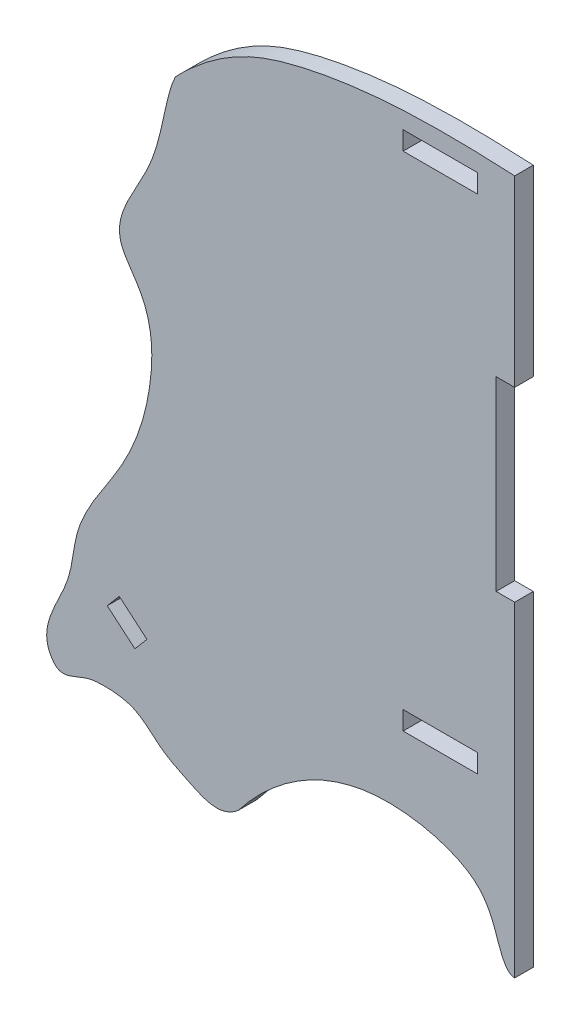
ISO-10303-21;
HEADER;
FILE_DESCRIPTION(('STEP AP214'),'2;1');
FILE_NAME('part.step','',(''),(''),'','','');
FILE_SCHEMA(('AUTOMOTIVE_DESIGN { 1 0 10303 214 1 1 1 1 }'));
ENDSEC;
DATA;
#1=APPLICATION_CONTEXT('core data for automotive mechanical design processes');
#2=APPLICATION_PROTOCOL_DEFINITION('international standard','automotive_design',2000,#1);
#3=PRODUCT_CONTEXT('',#1,'mechanical');
#4=PRODUCT('Part','Part','',(#3));
#5=PRODUCT_RELATED_PRODUCT_CATEGORY('part','',(#4));
#6=PRODUCT_DEFINITION_FORMATION('','',#4);
#7=PRODUCT_DEFINITION_CONTEXT('part definition',#1,'design');
#8=PRODUCT_DEFINITION('design','',#6,#7);
#9=PRODUCT_DEFINITION_SHAPE('','',#8);
#10=(LENGTH_UNIT() NAMED_UNIT(*) SI_UNIT(.MILLI.,.METRE.));
#11=(NAMED_UNIT(*) PLANE_ANGLE_UNIT() SI_UNIT($,.RADIAN.));
#12=(NAMED_UNIT(*) SI_UNIT($,.STERADIAN.) SOLID_ANGLE_UNIT());
#13=UNCERTAINTY_MEASURE_WITH_UNIT(LENGTH_MEASURE(1.E-05),#10,'distance_accuracy_value','');
#14=(GEOMETRIC_REPRESENTATION_CONTEXT(3) GLOBAL_UNCERTAINTY_ASSIGNED_CONTEXT((#13)) GLOBAL_UNIT_ASSIGNED_CONTEXT((#10,
#11,#12)) REPRESENTATION_CONTEXT('',''));
#15=CARTESIAN_POINT('',(0.,0.,0.));
#16=DIRECTION('',(0.,0.,1.));
#17=DIRECTION('',(1.,0.,0.));
#18=AXIS2_PLACEMENT_3D('',#15,#16,#17);
#19=CARTESIAN_POINT('',(123.117231850983,297.768158299305,0.558511618268249));
#20=DIRECTION('',(0.,0.,-1.));
#21=DIRECTION('',(-1.,0.,0.));
#22=AXIS2_PLACEMENT_3D('',#19,#20,#21);
#23=PLANE('',#22);
#24=DIRECTION('',(-1.,0.,0.));
#25=VECTOR('',#24,1.);
#26=CARTESIAN_POINT('',(123.117231850983,313.87680844309,0.558511618268249));
#27=LINE('',#26,#25);
#28=CARTESIAN_POINT('',(191.916318128345,313.87680844309,0.558511618268249));
#29=VERTEX_POINT('',#28);
#30=CARTESIAN_POINT('',(188.741318128345,313.87680844309,0.558511618268249));
#31=VERTEX_POINT('',#30);
#32=EDGE_CURVE('E362',#29,#31,#27,.T.);
#33=ORIENTED_EDGE('',*,*,#32,.F.);
#34=DIRECTION('',(0.,1.,0.));
#35=VECTOR('',#34,1.);
#36=CARTESIAN_POINT('',(191.916318128345,258.318555662201,0.558511618268249));
#37=LINE('',#36,#35);
#38=CARTESIAN_POINT('',(191.916318128345,258.318555662201,0.558511618268249));
#39=VERTEX_POINT('',#38);
#40=EDGE_CURVE('E322',#39,#29,#37,.T.);
#41=ORIENTED_EDGE('',*,*,#40,.F.);
#42=CARTESIAN_POINT('',(144.769687539417,259.544842569012,0.558511618268249));
#43=CARTESIAN_POINT('',(150.29639773086,266.721797116795,0.558511618268249));
#44=CARTESIAN_POINT('',(162.978632474186,276.12938968086,0.558511618268249));
#45=CARTESIAN_POINT('',(183.438337531095,271.813982255498,0.558511618268249));
#46=CARTESIAN_POINT('',(188.429136197785,265.777589499859,0.558511618268249));
#47=CARTESIAN_POINT('',(190.091835847159,258.338539578177,0.558511618268249));
#48=CARTESIAN_POINT('',(191.916318128345,258.318555662201,0.558511618268249));
#49=B_SPLINE_CURVE_WITH_KNOTS('',3,(#42,#43,#44,#45,#46,#47,#48),.UNSPECIFIED.,.F.,.F.,(4,1,1,1,
4),(0.,0.461148567866959,0.724471904206736,0.870774393200556,1.),.UNSPECIFIED.);
#50=CARTESIAN_POINT('',(144.769687539417,259.544842569012,0.558511618268249));
#51=VERTEX_POINT('',#50);
#52=EDGE_CURVE('E314',#51,#39,#49,.T.);
#53=ORIENTED_EDGE('',*,*,#52,.F.);
#54=CARTESIAN_POINT('',(133.999478323766,362.592540531734,0.558511618268249));
#55=CARTESIAN_POINT('',(132.225086022027,359.043755928256,0.558511618268249));
#56=CARTESIAN_POINT('',(131.718991404041,347.215999379062,0.558511618268249));
#57=CARTESIAN_POINT('',(121.59348862882,335.694092614909,0.558511618268249));
#58=CARTESIAN_POINT('',(130.114544976729,326.233660187884,0.558511618268249));
#59=CARTESIAN_POINT('',(130.349026805153,313.920019132553,0.558511618268249));
#60=CARTESIAN_POINT('',(125.602192039973,299.937731992035,0.558511618268249));
#61=CARTESIAN_POINT('',(116.738560739054,289.423865848565,0.558511618268249));
#62=CARTESIAN_POINT('',(116.321800980632,277.330302488856,0.558511618268249));
#63=CARTESIAN_POINT('',(109.999324026042,269.793746806495,0.558511618268249));
#64=CARTESIAN_POINT('',(114.535033749614,263.863367746362,0.558511618268249));
#65=CARTESIAN_POINT('',(118.172133947082,266.276595589519,0.558511618268249));
#66=CARTESIAN_POINT('',(122.391490283221,266.563369112397,0.558511618268249));
#67=CARTESIAN_POINT('',(127.574039437011,266.119644434109,0.558511618268249));
#68=CARTESIAN_POINT('',(131.335031689959,261.838429869952,0.558511618268249));
#69=CARTESIAN_POINT('',(137.381766546983,259.04921985697,0.558511618268249));
#70=CARTESIAN_POINT('',(141.619841476374,256.822631828868,0.558511618268249));
#71=CARTESIAN_POINT('',(144.769687539417,259.544842569012,0.558511618268249));
#72=B_SPLINE_CURVE_WITH_KNOTS('',3,(#54,#55,#56,#57,#58,#59,#60,#61,#62,#63,#64,#65,#66,#67,#68,
#69,#70,#71),.UNSPECIFIED.,.F.,.F.,(4,1,1,1,1,1,1,1,1,1,1,1,1,1,1,4),(0.,0.114205378378205,
0.2236235972446,0.270869686785501,0.365219368673239,0.477902129221363,0.593513084642484,
0.648017370225942,0.743465038591175,0.757288105268629,0.792684769494913,0.815193244013961,
0.853743181285876,0.899321619486176,0.933314838344055,1.),.UNSPECIFIED.);
#73=CARTESIAN_POINT('',(133.999478323766,362.592540531734,0.558511618268249));
#74=VERTEX_POINT('',#73);
#75=EDGE_CURVE('E264',#74,#51,#72,.T.);
#76=ORIENTED_EDGE('',*,*,#75,.F.);
#77=CARTESIAN_POINT('',(191.916318128345,376.899734652235,0.558511618268249));
#78=CARTESIAN_POINT('',(180.125512955205,377.5041531383,0.558511618268249));
#79=CARTESIAN_POINT('',(165.150769755078,377.50406242085,0.558511618268249));
#80=CARTESIAN_POINT('',(144.863568682566,371.975111744607,0.558511618268249));
#81=CARTESIAN_POINT('',(137.984827086445,366.718997179647,0.558511618268249));
#82=CARTESIAN_POINT('',(133.999478323766,362.592540531734,0.558511618268249));
#83=B_SPLINE_CURVE_WITH_KNOTS('',3,(#77,#78,#79,#80,#81,#82),.UNSPECIFIED.,.F.,.F.,(4,1,1,4),
(0.549425740135804,0.805603625701848,0.876196594203151,1.),.UNSPECIFIED.);
#84=CARTESIAN_POINT('',(191.916318128345,376.899734652235,0.558511618268249));
#85=VERTEX_POINT('',#84);
#86=EDGE_CURVE('E272',#85,#74,#83,.T.);
#87=ORIENTED_EDGE('',*,*,#86,.F.);
#88=CARTESIAN_POINT('',(191.916318128345,345.62680844309,0.558511618268249));
#89=VERTEX_POINT('',#88);
#90=EDGE_CURVE('E321',#89,#85,#37,.T.);
#91=ORIENTED_EDGE('',*,*,#90,.F.);
#92=DIRECTION('',(1.,0.,0.));
#93=VECTOR('',#92,1.);
#94=CARTESIAN_POINT('',(123.117231850983,345.62680844309,0.558511618268249));
#95=LINE('',#94,#93);
#96=CARTESIAN_POINT('',(188.741318128345,345.62680844309,0.558511618268249));
#97=VERTEX_POINT('',#96);
#98=EDGE_CURVE('E360',#97,#89,#95,.T.);
#99=ORIENTED_EDGE('',*,*,#98,.F.);
#100=DIRECTION('',(0.,-1.,0.));
#101=VECTOR('',#100,1.);
#102=CARTESIAN_POINT('',(188.741318128345,297.768158299305,0.558511618268249));
#103=LINE('',#102,#101);
#104=EDGE_CURVE('E357',#97,#31,#103,.T.);
#105=ORIENTED_EDGE('',*,*,#104,.T.);
#106=EDGE_LOOP('',(#33,#41,#53,#76,#87,#91,#99,#105));
#107=FACE_BOUND('',#106,.T.);
#108=DIRECTION('',(0.,1.,0.));
#109=VECTOR('',#108,1.);
#110=CARTESIAN_POINT('',(185.566318128345,371.02680844309,0.558511617910346));
#111=LINE('',#110,#109);
#112=CARTESIAN_POINT('',(185.566318128345,371.02680844309,0.558511617910346));
#113=VERTEX_POINT('',#112);
#114=CARTESIAN_POINT('',(185.566318128345,374.20180844309,0.558511617910346));
#115=VERTEX_POINT('',#114);
#116=EDGE_CURVE('E215',#113,#115,#111,.T.);
#117=ORIENTED_EDGE('',*,*,#116,.T.);
#118=DIRECTION('',(-1.,0.,0.));
#119=VECTOR('',#118,1.);
#120=CARTESIAN_POINT('',(123.117231850983,374.20180844309,0.558511618268249));
#121=LINE('',#120,#119);
#122=CARTESIAN_POINT('',(172.866318128345,374.20180844309,0.558511617910339));
#123=VERTEX_POINT('',#122);
#124=EDGE_CURVE('E354',#115,#123,#121,.T.);
#125=ORIENTED_EDGE('',*,*,#124,.T.);
#126=DIRECTION('',(0.,1.,0.));
#127=VECTOR('',#126,1.);
#128=CARTESIAN_POINT('',(172.866318128345,371.02680844309,0.558511617910339));
#129=LINE('',#128,#127);
#130=CARTESIAN_POINT('',(172.866318128345,371.02680844309,0.558511618268249));
#131=VERTEX_POINT('',#130);
#132=EDGE_CURVE('E212',#131,#123,#129,.T.);
#133=ORIENTED_EDGE('',*,*,#132,.F.);
#134=DIRECTION('',(-1.,0.,0.));
#135=VECTOR('',#134,1.);
#136=CARTESIAN_POINT('',(123.117231850983,371.02680844309,0.558511618268249));
#137=LINE('',#136,#135);
#138=EDGE_CURVE('E351',#113,#131,#137,.T.);
#139=ORIENTED_EDGE('',*,*,#138,.F.);
#140=EDGE_LOOP('',(#117,#125,#133,#139));
#141=FACE_BOUND('',#140,.T.);
#142=DIRECTION('',(-0.647381828332102,-0.762165840447724,0.));
#143=VECTOR('',#142,1.);
#144=CARTESIAN_POINT('',(140.72655181769,300.196717603194,0.558511618268255));
#145=LINE('',#144,#143);
#146=CARTESIAN_POINT('',(124.416384209225,280.994676305285,0.558511618268255));
#147=VERTEX_POINT('',#146);
#148=CARTESIAN_POINT('',(122.360946904271,278.574799761864,0.558511618268255));
#149=VERTEX_POINT('',#148);
#150=EDGE_CURVE('E249',#147,#149,#145,.T.);
#151=ORIENTED_EDGE('',*,*,#150,.T.);
#152=DIRECTION('',(0.762165840447724,-0.647381828332102,0.));
#153=VECTOR('',#152,1.);
#154=CARTESIAN_POINT('',(113.330030911781,286.245638044641,0.558511618268249));
#155=LINE('',#154,#153);
#156=CARTESIAN_POINT('',(127.079686497047,274.566713722216,0.558511618268255));
#157=VERTEX_POINT('',#156);
#158=EDGE_CURVE('E348',#149,#157,#155,.T.);
#159=ORIENTED_EDGE('',*,*,#158,.T.);
#160=DIRECTION('',(-0.647381828332102,-0.762165840447724,0.));
#161=VECTOR('',#160,1.);
#162=CARTESIAN_POINT('',(145.445291410466,296.188631563547,0.558511618268255));
#163=LINE('',#162,#161);
#164=CARTESIAN_POINT('',(129.135123802001,276.986590265638,0.558511618268249));
#165=VERTEX_POINT('',#164);
#166=EDGE_CURVE('E243',#165,#157,#163,.T.);
#167=ORIENTED_EDGE('',*,*,#166,.F.);
#168=DIRECTION('',(-0.762165840447724,0.647381828332102,0.));
#169=VECTOR('',#168,1.);
#170=CARTESIAN_POINT('',(115.385468216735,288.665514588062,0.558511618268249));
#171=LINE('',#170,#169);
#172=EDGE_CURVE('E345',#165,#147,#171,.T.);
#173=ORIENTED_EDGE('',*,*,#172,.T.);
#174=EDGE_LOOP('',(#151,#159,#167,#173));
#175=FACE_BOUND('',#174,.T.);
#176=DIRECTION('',(-1.,0.,0.));
#177=VECTOR('',#176,1.);
#178=CARTESIAN_POINT('',(123.117231850983,285.30180844309,0.558511618268249));
#179=LINE('',#178,#177);
#180=CARTESIAN_POINT('',(185.566318128345,285.30180844309,0.558511618268247));
#181=VERTEX_POINT('',#180);
#182=CARTESIAN_POINT('',(172.866318128345,285.30180844309,0.558511618268249));
#183=VERTEX_POINT('',#182);
#184=EDGE_CURVE('E367',#181,#183,#179,.T.);
#185=ORIENTED_EDGE('',*,*,#184,.F.);
#186=DIRECTION('',(0.,1.,0.));
#187=VECTOR('',#186,1.);
#188=CARTESIAN_POINT('',(185.566318128345,297.768158299305,0.558511618268249));
#189=LINE('',#188,#187);
#190=CARTESIAN_POINT('',(185.566318128345,288.47680844309,0.558511618268247));
#191=VERTEX_POINT('',#190);
#192=EDGE_CURVE('E11',#181,#191,#189,.T.);
#193=ORIENTED_EDGE('',*,*,#192,.T.);
#194=DIRECTION('',(-1.,0.,0.));
#195=VECTOR('',#194,1.);
#196=CARTESIAN_POINT('',(123.117231850983,288.47680844309,0.558511618268249));
#197=LINE('',#196,#195);
#198=CARTESIAN_POINT('',(172.866318128345,288.47680844309,0.558511618268247));
#199=VERTEX_POINT('',#198);
#200=EDGE_CURVE('E44',#191,#199,#197,.T.);
#201=ORIENTED_EDGE('',*,*,#200,.T.);
#202=DIRECTION('',(0.,1.,0.));
#203=VECTOR('',#202,1.);
#204=CARTESIAN_POINT('',(172.866318128345,297.768158299305,0.558511618268249));
#205=LINE('',#204,#203);
#206=EDGE_CURVE('E365',#183,#199,#205,.T.);
#207=ORIENTED_EDGE('',*,*,#206,.F.);
#208=EDGE_LOOP('',(#185,#193,#201,#207));
#209=FACE_BOUND('',#208,.T.);
#210=ADVANCED_FACE('F35',(#107,#141,#175,#209),#23,.T.);
#211=CARTESIAN_POINT('',(191.916318128345,258.318555662201,3.73351161791034));
#212=DIRECTION('',(-1.,0.,0.));
#213=DIRECTION('',(0.,0.,1.));
#214=AXIS2_PLACEMENT_3D('',#211,#212,#213);
#215=PLANE('',#214);
#216=ORIENTED_EDGE('',*,*,#40,.T.);
#217=DIRECTION('',(0.,0.,-1.));
#218=VECTOR('',#217,1.);
#219=CARTESIAN_POINT('',(191.916318128345,313.87680844309,3.73351161791033));
#220=LINE('',#219,#218);
#221=CARTESIAN_POINT('',(191.916318128345,313.87680844309,3.73351161791033));
#222=VERTEX_POINT('',#221);
#223=EDGE_CURVE('E202',#222,#29,#220,.T.);
#224=ORIENTED_EDGE('',*,*,#223,.F.);
#225=DIRECTION('',(0.,1.,0.));
#226=VECTOR('',#225,1.);
#227=CARTESIAN_POINT('',(191.916318128345,258.318555662201,3.73351161791034));
#228=LINE('',#227,#226);
#229=CARTESIAN_POINT('',(191.916318128345,258.318555662201,3.73351161791034));
#230=VERTEX_POINT('',#229);
#231=EDGE_CURVE('E281',#230,#222,#228,.T.);
#232=ORIENTED_EDGE('',*,*,#231,.F.);
#233=DIRECTION('',(0.,0.,-1.));
#234=VECTOR('',#233,1.);
#235=CARTESIAN_POINT('',(191.916318128345,258.318555662201,3.73351161791034));
#236=LINE('',#235,#234);
#237=EDGE_CURVE('E339',#230,#39,#236,.T.);
#238=ORIENTED_EDGE('',*,*,#237,.T.);
#239=EDGE_LOOP('',(#216,#224,#232,#238));
#240=FACE_BOUND('',#239,.T.);
#241=ADVANCED_FACE('F295',(#240),#215,.F.);
#242=CARTESIAN_POINT('',(123.117231850983,297.768158299305,3.73351161791034));
#243=DIRECTION('',(0.,0.,-1.));
#244=DIRECTION('',(-1.,0.,0.));
#245=AXIS2_PLACEMENT_3D('',#242,#243,#244);
#246=PLANE('',#245);
#247=DIRECTION('',(-1.,0.,0.));
#248=VECTOR('',#247,1.);
#249=CARTESIAN_POINT('',(123.117231850983,288.47680844309,3.73351161791034));
#250=LINE('',#249,#248);
#251=CARTESIAN_POINT('',(185.566318128345,288.47680844309,3.73351161611778));
#252=VERTEX_POINT('',#251);
#253=CARTESIAN_POINT('',(172.866318128345,288.47680844309,3.73351161791034));
#254=VERTEX_POINT('',#253);
#255=EDGE_CURVE('E180',#252,#254,#250,.T.);
#256=ORIENTED_EDGE('',*,*,#255,.F.);
#257=DIRECTION('',(0.,1.,0.));
#258=VECTOR('',#257,1.);
#259=CARTESIAN_POINT('',(185.566318128345,285.30180844309,3.73351161611778));
#260=LINE('',#259,#258);
#261=CARTESIAN_POINT('',(185.566318128345,285.30180844309,3.73351161611778));
#262=VERTEX_POINT('',#261);
#263=EDGE_CURVE('E187',#262,#252,#260,.T.);
#264=ORIENTED_EDGE('',*,*,#263,.F.);
#265=DIRECTION('',(-1.,0.,0.));
#266=VECTOR('',#265,1.);
#267=CARTESIAN_POINT('',(123.117231850983,285.30180844309,3.73351161791034));
#268=LINE('',#267,#266);
#269=CARTESIAN_POINT('',(172.866318128345,285.30180844309,3.73351161611779));
#270=VERTEX_POINT('',#269);
#271=EDGE_CURVE('E172',#262,#270,#268,.T.);
#272=ORIENTED_EDGE('',*,*,#271,.T.);
#273=DIRECTION('',(0.,1.,0.));
#274=VECTOR('',#273,1.);
#275=CARTESIAN_POINT('',(172.866318128345,285.30180844309,3.73351161611779));
#276=LINE('',#275,#274);
#277=EDGE_CURVE('E181',#270,#254,#276,.T.);
#278=ORIENTED_EDGE('',*,*,#277,.T.);
#279=EDGE_LOOP('',(#256,#264,#272,#278));
#280=FACE_BOUND('',#279,.T.);
#281=DIRECTION('',(0.647381828332102,0.762165840447724,0.));
#282=VECTOR('',#281,1.);
#283=CARTESIAN_POINT('',(-66.2495036972205,56.5227799047886,3.73351161898408));
#284=LINE('',#283,#282);
#285=CARTESIAN_POINT('',(122.360946904271,278.574799761863,3.73351161898408));
#286=VERTEX_POINT('',#285);
#287=CARTESIAN_POINT('',(124.416384209225,280.994676305285,3.73351161898408));
#288=VERTEX_POINT('',#287);
#289=EDGE_CURVE('E259',#286,#288,#284,.T.);
#290=ORIENTED_EDGE('',*,*,#289,.T.);
#291=DIRECTION('',(-0.762165840447724,0.647381828332102,0.));
#292=VECTOR('',#291,1.);
#293=CARTESIAN_POINT('',(146.39407456305,262.326879077036,3.73351161898408));
#294=LINE('',#293,#292);
#295=CARTESIAN_POINT('',(129.135123802001,276.986590265638,3.73351161898408));
#296=VERTEX_POINT('',#295);
#297=EDGE_CURVE('E257',#296,#288,#294,.T.);
#298=ORIENTED_EDGE('',*,*,#297,.F.);
#299=DIRECTION('',(-0.647381828332102,-0.762165840447724,0.));
#300=VECTOR('',#299,1.);
#301=CARTESIAN_POINT('',(-61.5307641044441,52.5146938651412,3.73351161898408));
#302=LINE('',#301,#300);
#303=CARTESIAN_POINT('',(127.079686497047,274.566713722216,3.73351161791034));
#304=VERTEX_POINT('',#303);
#305=EDGE_CURVE('E262',#296,#304,#302,.T.);
#306=ORIENTED_EDGE('',*,*,#305,.T.);
#307=DIRECTION('',(0.762165840447724,-0.647381828332101,0.));
#308=VECTOR('',#307,1.);
#309=CARTESIAN_POINT('',(105.42181110032,292.962860896544,3.73351161898408));
#310=LINE('',#309,#308);
#311=EDGE_CURVE('E255',#286,#304,#310,.T.);
#312=ORIENTED_EDGE('',*,*,#311,.F.);
#313=EDGE_LOOP('',(#290,#298,#306,#312));
#314=FACE_BOUND('',#313,.T.);
#315=DIRECTION('',(-1.,0.,0.));
#316=VECTOR('',#315,1.);
#317=CARTESIAN_POINT('',(123.117231850983,374.20180844309,3.73351161791034));
#318=LINE('',#317,#316);
#319=CARTESIAN_POINT('',(185.566318128345,374.20180844309,3.73351161791034));
#320=VERTEX_POINT('',#319);
#321=CARTESIAN_POINT('',(172.866318128345,374.20180844309,3.73351161791034));
#322=VERTEX_POINT('',#321);
#323=EDGE_CURVE('E237',#320,#322,#318,.T.);
#324=ORIENTED_EDGE('',*,*,#323,.F.);
#325=DIRECTION('',(0.,-1.,0.));
#326=VECTOR('',#325,1.);
#327=CARTESIAN_POINT('',(185.566318128345,297.768158299305,3.73351161791034));
#328=LINE('',#327,#326);
#329=CARTESIAN_POINT('',(185.566318128345,371.02680844309,3.73351161791034));
#330=VERTEX_POINT('',#329);
#331=EDGE_CURVE('E231',#320,#330,#328,.T.);
#332=ORIENTED_EDGE('',*,*,#331,.T.);
#333=DIRECTION('',(-1.,0.,0.));
#334=VECTOR('',#333,1.);
#335=CARTESIAN_POINT('',(123.117231850983,371.02680844309,3.73351161791034));
#336=LINE('',#335,#334);
#337=CARTESIAN_POINT('',(172.866318128345,371.02680844309,3.73351161791034));
#338=VERTEX_POINT('',#337);
#339=EDGE_CURVE('E234',#330,#338,#336,.T.);
#340=ORIENTED_EDGE('',*,*,#339,.T.);
#341=DIRECTION('',(0.,-1.,0.));
#342=VECTOR('',#341,1.);
#343=CARTESIAN_POINT('',(172.866318128345,297.768158299305,3.73351161791034));
#344=LINE('',#343,#342);
#345=EDGE_CURVE('E227',#322,#338,#344,.T.);
#346=ORIENTED_EDGE('',*,*,#345,.F.);
#347=EDGE_LOOP('',(#324,#332,#340,#346));
#348=FACE_BOUND('',#347,.T.);
#349=ORIENTED_EDGE('',*,*,#231,.T.);
#350=DIRECTION('',(1.,0.,0.));
#351=VECTOR('',#350,1.);
#352=CARTESIAN_POINT('',(188.741318128345,313.87680844309,3.73351161791033));
#353=LINE('',#352,#351);
#354=CARTESIAN_POINT('',(188.741318128345,313.87680844309,3.73351161791033));
#355=VERTEX_POINT('',#354);
#356=EDGE_CURVE('E210',#355,#222,#353,.T.);
#357=ORIENTED_EDGE('',*,*,#356,.F.);
#358=DIRECTION('',(0.,-1.,0.));
#359=VECTOR('',#358,1.);
#360=CARTESIAN_POINT('',(188.741318128345,345.62680844309,3.73351161791034));
#361=LINE('',#360,#359);
#362=CARTESIAN_POINT('',(188.741318128345,345.62680844309,3.73351161791034));
#363=VERTEX_POINT('',#362);
#364=EDGE_CURVE('E201',#363,#355,#361,.T.);
#365=ORIENTED_EDGE('',*,*,#364,.F.);
#366=DIRECTION('',(1.,0.,0.));
#367=VECTOR('',#366,1.);
#368=CARTESIAN_POINT('',(188.741318128345,345.62680844309,3.73351161791034));
#369=LINE('',#368,#367);
#370=CARTESIAN_POINT('',(191.916318128345,345.62680844309,3.73351161791034));
#371=VERTEX_POINT('',#370);
#372=EDGE_CURVE('E207',#363,#371,#369,.T.);
#373=ORIENTED_EDGE('',*,*,#372,.T.);
#374=CARTESIAN_POINT('',(191.916318128345,376.899734652235,3.73351161791034));
#375=VERTEX_POINT('',#374);
#376=EDGE_CURVE('E280',#371,#375,#228,.T.);
#377=ORIENTED_EDGE('',*,*,#376,.T.);
#378=CARTESIAN_POINT('',(191.916318128345,376.899734652235,3.73351161791034));
#379=CARTESIAN_POINT('',(180.125512955205,377.5041531383,3.73351161791034));
#380=CARTESIAN_POINT('',(165.150769755078,377.50406242085,3.73351161791034));
#381=CARTESIAN_POINT('',(144.863568682566,371.975111744607,3.73351161791034));
#382=CARTESIAN_POINT('',(137.984827086445,366.718997179647,3.73351161791034));
#383=CARTESIAN_POINT('',(133.999478323766,362.592540531734,3.73351161791034));
#384=B_SPLINE_CURVE_WITH_KNOTS('',3,(#378,#379,#380,#381,#382,#383),.UNSPECIFIED.,.F.,.F.,(4,1,
1,4),(0.549425740135804,0.805603625701848,0.876196594203151,1.),.UNSPECIFIED.);
#385=CARTESIAN_POINT('',(133.999478323766,362.592540531734,3.73351161791034));
#386=VERTEX_POINT('',#385);
#387=EDGE_CURVE('E301',#375,#386,#384,.T.);
#388=ORIENTED_EDGE('',*,*,#387,.T.);
#389=CARTESIAN_POINT('',(133.999478323766,362.592540531734,3.73351161791034));
#390=CARTESIAN_POINT('',(132.225086022027,359.043755928256,3.73351161791034));
#391=CARTESIAN_POINT('',(131.718991404041,347.215999379062,3.73351161791034));
#392=CARTESIAN_POINT('',(121.59348862882,335.694092614909,3.73351161791034));
#393=CARTESIAN_POINT('',(130.114544976729,326.233660187884,3.73351161791034));
#394=CARTESIAN_POINT('',(130.349026805153,313.920019132553,3.73351161791034));
#395=CARTESIAN_POINT('',(125.602192039973,299.937731992035,3.73351161791034));
#396=CARTESIAN_POINT('',(116.738560739054,289.423865848565,3.73351161791034));
#397=CARTESIAN_POINT('',(116.321800980632,277.330302488856,3.73351161791034));
#398=CARTESIAN_POINT('',(109.999324026042,269.793746806495,3.73351161791034));
#399=CARTESIAN_POINT('',(114.535033749614,263.863367746362,3.73351161791034));
#400=CARTESIAN_POINT('',(118.172133947082,266.276595589519,3.73351161791034));
#401=CARTESIAN_POINT('',(122.391490283221,266.563369112397,3.73351161791034));
#402=CARTESIAN_POINT('',(127.574039437011,266.119644434109,3.73351161791034));
#403=CARTESIAN_POINT('',(131.335031689959,261.838429869952,3.73351161791034));
#404=CARTESIAN_POINT('',(137.381766546983,259.04921985697,3.73351161791034));
#405=CARTESIAN_POINT('',(141.619841476374,256.822631828868,3.73351161791034));
#406=CARTESIAN_POINT('',(144.769687539417,259.544842569012,3.73351161791034));
#407=B_SPLINE_CURVE_WITH_KNOTS('',3,(#389,#390,#391,#392,#393,#394,#395,#396,#397,#398,#399,
#400,#401,#402,#403,#404,#405,#406),.UNSPECIFIED.,.F.,.F.,(4,1,1,1,1,1,1,1,1,1,1,1,1,1,1,4),(0.,
0.114205378378205,0.2236235972446,0.270869686785501,0.365219368673239,0.477902129221363,
0.593513084642484,0.648017370225942,0.743465038591175,0.757288105268629,0.792684769494913,
0.815193244013961,0.853743181285876,0.899321619486176,0.933314838344055,1.),.UNSPECIFIED.);
#408=CARTESIAN_POINT('',(144.769687539417,259.544842569012,3.73351161791034));
#409=VERTEX_POINT('',#408);
#410=EDGE_CURVE('E265',#386,#409,#407,.T.);
#411=ORIENTED_EDGE('',*,*,#410,.T.);
#412=CARTESIAN_POINT('',(144.769687539417,259.544842569012,3.73351161791034));
#413=CARTESIAN_POINT('',(150.29639773086,266.721797116795,3.73351161791034));
#414=CARTESIAN_POINT('',(162.978632474186,276.12938968086,3.73351161791034));
#415=CARTESIAN_POINT('',(183.438337531095,271.813982255498,3.73351161791034));
#416=CARTESIAN_POINT('',(188.429136197785,265.777589499859,3.73351161791034));
#417=CARTESIAN_POINT('',(190.091835847159,258.338539578177,3.73351161791034));
#418=CARTESIAN_POINT('',(191.916318128345,258.318555662201,3.73351161791034));
#419=B_SPLINE_CURVE_WITH_KNOTS('',3,(#412,#413,#414,#415,#416,#417,#418),.UNSPECIFIED.,.F.,.F.,
(4,1,1,1,4),(0.,0.461148567866959,0.724471904206736,0.870774393200556,1.),.UNSPECIFIED.);
#420=EDGE_CURVE('E271',#409,#230,#419,.T.);
#421=ORIENTED_EDGE('',*,*,#420,.T.);
#422=EDGE_LOOP('',(#349,#357,#365,#373,#377,#388,#411,#421));
#423=FACE_BOUND('',#422,.T.);
#424=ADVANCED_FACE('F190',(#280,#314,#348,#423),#246,.F.);
#425=DIRECTION('',(0.,0.,-1.));
#426=VECTOR('',#425,1.);
#427=SURFACE_OF_LINEAR_EXTRUSION('',#407,#426);
#428=ORIENTED_EDGE('',*,*,#75,.T.);
#429=DIRECTION('',(0.,0.,-1.));
#430=VECTOR('',#429,1.);
#431=CARTESIAN_POINT('',(144.769687539417,259.544842569012,3.73351161791034));
#432=LINE('',#431,#430);
#433=EDGE_CURVE('E342',#409,#51,#432,.T.);
#434=ORIENTED_EDGE('',*,*,#433,.F.);
#435=ORIENTED_EDGE('',*,*,#410,.F.);
#436=DIRECTION('',(0.,0.,-1.));
#437=VECTOR('',#436,1.);
#438=CARTESIAN_POINT('',(133.999478323766,362.592540531734,3.73351161791034));
#439=LINE('',#438,#437);
#440=EDGE_CURVE('E306',#386,#74,#439,.T.);
#441=ORIENTED_EDGE('',*,*,#440,.T.);
#442=EDGE_LOOP('',(#428,#434,#435,#441));
#443=FACE_BOUND('',#442,.T.);
#444=ADVANCED_FACE('F37',(#443),#427,.F.);
#445=DIRECTION('',(0.,0.,-1.));
#446=VECTOR('',#445,1.);
#447=SURFACE_OF_LINEAR_EXTRUSION('',#419,#446);
#448=ORIENTED_EDGE('',*,*,#52,.T.);
#449=ORIENTED_EDGE('',*,*,#237,.F.);
#450=ORIENTED_EDGE('',*,*,#420,.F.);
#451=ORIENTED_EDGE('',*,*,#433,.T.);
#452=EDGE_LOOP('',(#448,#449,#450,#451));
#453=FACE_BOUND('',#452,.T.);
#454=ADVANCED_FACE('F286',(#453),#447,.F.);
#455=ORIENTED_EDGE('',*,*,#376,.F.);
#456=DIRECTION('',(0.,0.,1.));
#457=VECTOR('',#456,1.);
#458=CARTESIAN_POINT('',(191.916318128345,345.62680844309,3.73351161791034));
#459=LINE('',#458,#457);
#460=EDGE_CURVE('E198',#89,#371,#459,.T.);
#461=ORIENTED_EDGE('',*,*,#460,.F.);
#462=ORIENTED_EDGE('',*,*,#90,.T.);
#463=DIRECTION('',(0.,0.,-1.));
#464=VECTOR('',#463,1.);
#465=CARTESIAN_POINT('',(191.916318128345,376.899734652235,3.73351161791034));
#466=LINE('',#465,#464);
#467=EDGE_CURVE('E336',#375,#85,#466,.T.);
#468=ORIENTED_EDGE('',*,*,#467,.F.);
#469=EDGE_LOOP('',(#455,#461,#462,#468));
#470=FACE_BOUND('',#469,.T.);
#471=ADVANCED_FACE('F289',(#470),#215,.F.);
#472=DIRECTION('',(0.,0.,-1.));
#473=VECTOR('',#472,1.);
#474=SURFACE_OF_LINEAR_EXTRUSION('',#384,#473);
#475=ORIENTED_EDGE('',*,*,#86,.T.);
#476=ORIENTED_EDGE('',*,*,#440,.F.);
#477=ORIENTED_EDGE('',*,*,#387,.F.);
#478=ORIENTED_EDGE('',*,*,#467,.T.);
#479=EDGE_LOOP('',(#475,#476,#477,#478));
#480=FACE_BOUND('',#479,.T.);
#481=ADVANCED_FACE('F293',(#480),#474,.F.);
#482=CARTESIAN_POINT('',(105.42181110032,292.962860896544,3.73351161898408));
#483=DIRECTION('',(0.647381828332102,0.762165840447724,0.));
#484=DIRECTION('',(0.762165840447724,-0.647381828332102,0.));
#485=AXIS2_PLACEMENT_3D('',#482,#483,#484);
#486=PLANE('',#485);
#487=DIRECTION('',(0.,0.,1.));
#488=VECTOR('',#487,1.);
#489=CARTESIAN_POINT('',(122.360946904271,278.574799761864,3.73351161898408));
#490=LINE('',#489,#488);
#491=EDGE_CURVE('E247',#149,#286,#490,.T.);
#492=ORIENTED_EDGE('',*,*,#491,.T.);
#493=ORIENTED_EDGE('',*,*,#311,.T.);
#494=DIRECTION('',(0.,0.,-1.));
#495=VECTOR('',#494,1.);
#496=CARTESIAN_POINT('',(127.079686497047,274.566713722216,3.73351161898408));
#497=LINE('',#496,#495);
#498=EDGE_CURVE('E240',#304,#157,#497,.T.);
#499=ORIENTED_EDGE('',*,*,#498,.T.);
#500=ORIENTED_EDGE('',*,*,#158,.F.);
#501=EDGE_LOOP('',(#492,#493,#499,#500));
#502=FACE_BOUND('',#501,.T.);
#503=ADVANCED_FACE('F298',(#502),#486,.T.);
#504=CARTESIAN_POINT('',(146.39407456305,262.326879077036,3.73351161898408));
#505=DIRECTION('',(-0.647381828332102,-0.762165840447724,0.));
#506=DIRECTION('',(-0.762165840447724,0.647381828332102,0.));
#507=AXIS2_PLACEMENT_3D('',#504,#505,#506);
#508=PLANE('',#507);
#509=DIRECTION('',(0.,0.,-1.));
#510=VECTOR('',#509,1.);
#511=CARTESIAN_POINT('',(129.135123802001,276.986590265638,3.73351161898408));
#512=LINE('',#511,#510);
#513=EDGE_CURVE('E245',#296,#165,#512,.T.);
#514=ORIENTED_EDGE('',*,*,#513,.F.);
#515=ORIENTED_EDGE('',*,*,#297,.T.);
#516=DIRECTION('',(0.,0.,1.));
#517=VECTOR('',#516,1.);
#518=CARTESIAN_POINT('',(124.416384209225,280.994676305285,3.73351161898408));
#519=LINE('',#518,#517);
#520=EDGE_CURVE('E252',#147,#288,#519,.T.);
#521=ORIENTED_EDGE('',*,*,#520,.F.);
#522=ORIENTED_EDGE('',*,*,#172,.F.);
#523=EDGE_LOOP('',(#514,#515,#521,#522));
#524=FACE_BOUND('',#523,.T.);
#525=ADVANCED_FACE('F410',(#524),#508,.T.);
#526=CARTESIAN_POINT('',(140.72655181769,300.196717603194,3.73351161898408));
#527=DIRECTION('',(0.762165840447724,-0.647381828332102,0.));
#528=DIRECTION('',(-0.647381828332102,-0.762165840447724,0.));
#529=AXIS2_PLACEMENT_3D('',#526,#527,#528);
#530=PLANE('',#529);
#531=ORIENTED_EDGE('',*,*,#150,.F.);
#532=ORIENTED_EDGE('',*,*,#520,.T.);
#533=ORIENTED_EDGE('',*,*,#289,.F.);
#534=ORIENTED_EDGE('',*,*,#491,.F.);
#535=EDGE_LOOP('',(#531,#532,#533,#534));
#536=FACE_BOUND('',#535,.T.);
#537=ADVANCED_FACE('F399',(#536),#530,.T.);
#538=CARTESIAN_POINT('',(145.445291410466,296.188631563547,3.73351161898408));
#539=DIRECTION('',(-0.762165840447724,0.647381828332102,0.));
#540=DIRECTION('',(0.647381828332102,0.762165840447724,0.));
#541=AXIS2_PLACEMENT_3D('',#538,#539,#540);
#542=PLANE('',#541);
#543=ORIENTED_EDGE('',*,*,#305,.F.);
#544=ORIENTED_EDGE('',*,*,#513,.T.);
#545=ORIENTED_EDGE('',*,*,#166,.T.);
#546=ORIENTED_EDGE('',*,*,#498,.F.);
#547=EDGE_LOOP('',(#543,#544,#545,#546));
#548=FACE_BOUND('',#547,.T.);
#549=ADVANCED_FACE('F406',(#548),#542,.T.);
#550=CARTESIAN_POINT('',(191.916318128345,374.20180844309,13.2585116179103));
#551=DIRECTION('',(0.,-1.,0.));
#552=DIRECTION('',(0.,0.,-1.));
#553=AXIS2_PLACEMENT_3D('',#550,#551,#552);
#554=PLANE('',#553);
#555=ORIENTED_EDGE('',*,*,#323,.T.);
#556=DIRECTION('',(0.,0.,-1.));
#557=VECTOR('',#556,1.);
#558=CARTESIAN_POINT('',(172.866318128345,374.20180844309,3.73351161790991));
#559=LINE('',#558,#557);
#560=EDGE_CURVE('E221',#322,#123,#559,.T.);
#561=ORIENTED_EDGE('',*,*,#560,.T.);
#562=ORIENTED_EDGE('',*,*,#124,.F.);
#563=DIRECTION('',(0.,0.,-1.));
#564=VECTOR('',#563,1.);
#565=CARTESIAN_POINT('',(185.566318128345,374.20180844309,3.73351161791034));
#566=LINE('',#565,#564);
#567=EDGE_CURVE('E223',#320,#115,#566,.T.);
#568=ORIENTED_EDGE('',*,*,#567,.F.);
#569=EDGE_LOOP('',(#555,#561,#562,#568));
#570=FACE_BOUND('',#569,.T.);
#571=ADVANCED_FACE('F473',(#570),#554,.T.);
#572=CARTESIAN_POINT('',(191.916318128345,371.02680844309,13.2585116179103));
#573=DIRECTION('',(0.,-1.,0.));
#574=DIRECTION('',(0.,0.,-1.));
#575=AXIS2_PLACEMENT_3D('',#572,#573,#574);
#576=PLANE('',#575);
#577=DIRECTION('',(0.,0.,-1.));
#578=VECTOR('',#577,1.);
#579=CARTESIAN_POINT('',(185.566318128345,371.02680844309,3.73351161791034));
#580=LINE('',#579,#578);
#581=EDGE_CURVE('E224',#330,#113,#580,.T.);
#582=ORIENTED_EDGE('',*,*,#581,.T.);
#583=ORIENTED_EDGE('',*,*,#138,.T.);
#584=DIRECTION('',(0.,0.,-1.));
#585=VECTOR('',#584,1.);
#586=CARTESIAN_POINT('',(172.866318128345,371.02680844309,3.73351161790991));
#587=LINE('',#586,#585);
#588=EDGE_CURVE('E218',#338,#131,#587,.T.);
#589=ORIENTED_EDGE('',*,*,#588,.F.);
#590=ORIENTED_EDGE('',*,*,#339,.F.);
#591=EDGE_LOOP('',(#582,#583,#589,#590));
#592=FACE_BOUND('',#591,.T.);
#593=ADVANCED_FACE('F468',(#592),#576,.F.);
#594=CARTESIAN_POINT('',(185.566318128345,371.02680844309,3.73351161791034));
#595=DIRECTION('',(1.,0.,0.));
#596=DIRECTION('',(0.,0.,-1.));
#597=AXIS2_PLACEMENT_3D('',#594,#595,#596);
#598=PLANE('',#597);
#599=ORIENTED_EDGE('',*,*,#567,.T.);
#600=ORIENTED_EDGE('',*,*,#116,.F.);
#601=ORIENTED_EDGE('',*,*,#581,.F.);
#602=ORIENTED_EDGE('',*,*,#331,.F.);
#603=EDGE_LOOP('',(#599,#600,#601,#602));
#604=FACE_BOUND('',#603,.T.);
#605=ADVANCED_FACE('F461',(#604),#598,.F.);
#606=CARTESIAN_POINT('',(172.866318128345,371.02680844309,3.73351161790991));
#607=DIRECTION('',(1.,0.,0.));
#608=DIRECTION('',(0.,0.,-1.));
#609=AXIS2_PLACEMENT_3D('',#606,#607,#608);
#610=PLANE('',#609);
#611=ORIENTED_EDGE('',*,*,#345,.T.);
#612=ORIENTED_EDGE('',*,*,#588,.T.);
#613=ORIENTED_EDGE('',*,*,#132,.T.);
#614=ORIENTED_EDGE('',*,*,#560,.F.);
#615=EDGE_LOOP('',(#611,#612,#613,#614));
#616=FACE_BOUND('',#615,.T.);
#617=ADVANCED_FACE('F454',(#616),#610,.T.);
#618=CARTESIAN_POINT('',(188.741318128345,313.87680844309,3.73351161791033));
#619=DIRECTION('',(0.,-1.,0.));
#620=DIRECTION('',(-1.,0.,0.));
#621=AXIS2_PLACEMENT_3D('',#618,#619,#620);
#622=PLANE('',#621);
#623=ORIENTED_EDGE('',*,*,#32,.T.);
#624=DIRECTION('',(0.,0.,-1.));
#625=VECTOR('',#624,1.);
#626=CARTESIAN_POINT('',(188.741318128345,313.87680844309,3.73351161791033));
#627=LINE('',#626,#625);
#628=EDGE_CURVE('E205',#355,#31,#627,.T.);
#629=ORIENTED_EDGE('',*,*,#628,.F.);
#630=ORIENTED_EDGE('',*,*,#356,.T.);
#631=ORIENTED_EDGE('',*,*,#223,.T.);
#632=EDGE_LOOP('',(#623,#629,#630,#631));
#633=FACE_BOUND('',#632,.T.);
#634=ADVANCED_FACE('F451',(#633),#622,.F.);
#635=CARTESIAN_POINT('',(188.741318128345,345.62680844309,3.73351161791034));
#636=DIRECTION('',(0.,1.,0.));
#637=DIRECTION('',(1.,0.,0.));
#638=AXIS2_PLACEMENT_3D('',#635,#636,#637);
#639=PLANE('',#638);
#640=ORIENTED_EDGE('',*,*,#98,.T.);
#641=ORIENTED_EDGE('',*,*,#460,.T.);
#642=ORIENTED_EDGE('',*,*,#372,.F.);
#643=DIRECTION('',(0.,0.,1.));
#644=VECTOR('',#643,1.);
#645=CARTESIAN_POINT('',(188.741318128345,345.62680844309,3.73351161791034));
#646=LINE('',#645,#644);
#647=EDGE_CURVE('E199',#97,#363,#646,.T.);
#648=ORIENTED_EDGE('',*,*,#647,.F.);
#649=EDGE_LOOP('',(#640,#641,#642,#648));
#650=FACE_BOUND('',#649,.T.);
#651=ADVANCED_FACE('F444',(#650),#639,.F.);
#652=CARTESIAN_POINT('',(188.741318128345,-0.595468646449882,-6.35000383995445));
#653=DIRECTION('',(1.,0.,0.));
#654=DIRECTION('',(0.,0.,-1.));
#655=AXIS2_PLACEMENT_3D('',#652,#653,#654);
#656=PLANE('',#655);
#657=ORIENTED_EDGE('',*,*,#647,.T.);
#658=ORIENTED_EDGE('',*,*,#364,.T.);
#659=ORIENTED_EDGE('',*,*,#628,.T.);
#660=ORIENTED_EDGE('',*,*,#104,.F.);
#661=EDGE_LOOP('',(#657,#658,#659,#660));
#662=FACE_BOUND('',#661,.T.);
#663=ADVANCED_FACE('F448',(#662),#656,.T.);
#664=CARTESIAN_POINT('',(191.916318128345,288.47680844309,67.2335116161178));
#665=DIRECTION('',(0.,-1.,0.));
#666=DIRECTION('',(0.,0.,-1.));
#667=AXIS2_PLACEMENT_3D('',#664,#665,#666);
#668=PLANE('',#667);
#669=ORIENTED_EDGE('',*,*,#255,.T.);
#670=DIRECTION('',(0.,0.,1.));
#671=VECTOR('',#670,1.);
#672=CARTESIAN_POINT('',(172.866318128344,288.47680844309,57.7085116161182));
#673=LINE('',#672,#671);
#674=EDGE_CURVE('E51',#199,#254,#673,.T.);
#675=ORIENTED_EDGE('',*,*,#674,.F.);
#676=ORIENTED_EDGE('',*,*,#200,.F.);
#677=DIRECTION('',(0.,0.,1.));
#678=VECTOR('',#677,1.);
#679=CARTESIAN_POINT('',(185.566318128345,288.47680844309,57.7085116161178));
#680=LINE('',#679,#678);
#681=EDGE_CURVE('E373',#191,#252,#680,.T.);
#682=ORIENTED_EDGE('',*,*,#681,.T.);
#683=EDGE_LOOP('',(#669,#675,#676,#682));
#684=FACE_BOUND('',#683,.T.);
#685=ADVANCED_FACE('F372',(#684),#668,.T.);
#686=CARTESIAN_POINT('',(191.916318128345,285.30180844309,67.2335116161178));
#687=DIRECTION('',(0.,-1.,0.));
#688=DIRECTION('',(0.,0.,-1.));
#689=AXIS2_PLACEMENT_3D('',#686,#687,#688);
#690=PLANE('',#689);
#691=DIRECTION('',(0.,0.,1.));
#692=VECTOR('',#691,1.);
#693=CARTESIAN_POINT('',(185.566318128345,285.30180844309,57.7085116161178));
#694=LINE('',#693,#692);
#695=EDGE_CURVE('E175',#181,#262,#694,.T.);
#696=ORIENTED_EDGE('',*,*,#695,.F.);
#697=ORIENTED_EDGE('',*,*,#184,.T.);
#698=DIRECTION('',(0.,0.,1.));
#699=VECTOR('',#698,1.);
#700=CARTESIAN_POINT('',(172.866318128344,285.30180844309,57.7085116161182));
#701=LINE('',#700,#699);
#702=EDGE_CURVE('E56',#183,#270,#701,.T.);
#703=ORIENTED_EDGE('',*,*,#702,.T.);
#704=ORIENTED_EDGE('',*,*,#271,.F.);
#705=EDGE_LOOP('',(#696,#697,#703,#704));
#706=FACE_BOUND('',#705,.T.);
#707=ADVANCED_FACE('F174',(#706),#690,.F.);
#708=CARTESIAN_POINT('',(185.566318128345,285.30180844309,57.7085116161178));
#709=DIRECTION('',(-1.,0.,0.));
#710=DIRECTION('',(0.,0.,1.));
#711=AXIS2_PLACEMENT_3D('',#708,#709,#710);
#712=PLANE('',#711);
#713=ORIENTED_EDGE('',*,*,#695,.T.);
#714=ORIENTED_EDGE('',*,*,#263,.T.);
#715=ORIENTED_EDGE('',*,*,#681,.F.);
#716=ORIENTED_EDGE('',*,*,#192,.F.);
#717=EDGE_LOOP('',(#713,#714,#715,#716));
#718=FACE_BOUND('',#717,.T.);
#719=ADVANCED_FACE('F185',(#718),#712,.T.);
#720=CARTESIAN_POINT('',(172.866318128344,285.30180844309,57.7085116161182));
#721=DIRECTION('',(-1.,0.,0.));
#722=DIRECTION('',(0.,0.,1.));
#723=AXIS2_PLACEMENT_3D('',#720,#721,#722);
#724=PLANE('',#723);
#725=ORIENTED_EDGE('',*,*,#206,.T.);
#726=ORIENTED_EDGE('',*,*,#674,.T.);
#727=ORIENTED_EDGE('',*,*,#277,.F.);
#728=ORIENTED_EDGE('',*,*,#702,.F.);
#729=EDGE_LOOP('',(#725,#726,#727,#728));
#730=FACE_BOUND('',#729,.T.);
#731=ADVANCED_FACE('F375',(#730),#724,.F.);
#732=CLOSED_SHELL('',(#210,#241,#424,#444,#454,#471,#481,#503,#525,#537,#549,#571,#593,#605,
#617,#634,#651,#663,#685,#707,#719,#731));
#733=MANIFOLD_SOLID_BREP('B2',#732);
#734=ADVANCED_BREP_SHAPE_REPRESENTATION('',(#18,#733),#14);
#735=SHAPE_DEFINITION_REPRESENTATION(#9,#734);
ENDSEC;
END-ISO-10303-21;
